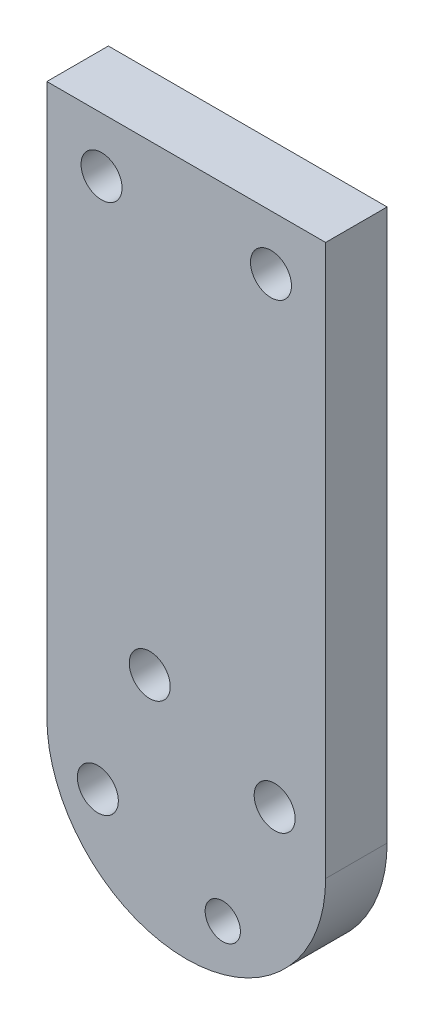
ISO-10303-21;
HEADER;
FILE_DESCRIPTION(('STEP AP214'),'2;1');
FILE_NAME('part.step','',(''),(''),'','','');
FILE_SCHEMA(('AUTOMOTIVE_DESIGN { 1 0 10303 214 1 1 1 1 }'));
ENDSEC;
DATA;
#1=APPLICATION_CONTEXT('core data for automotive mechanical design processes');
#2=APPLICATION_PROTOCOL_DEFINITION('international standard','automotive_design',2000,#1);
#3=PRODUCT_CONTEXT('',#1,'mechanical');
#4=PRODUCT('Part','Part','',(#3));
#5=PRODUCT_RELATED_PRODUCT_CATEGORY('part','',(#4));
#6=PRODUCT_DEFINITION_FORMATION('','',#4);
#7=PRODUCT_DEFINITION_CONTEXT('part definition',#1,'design');
#8=PRODUCT_DEFINITION('design','',#6,#7);
#9=PRODUCT_DEFINITION_SHAPE('','',#8);
#10=(LENGTH_UNIT() NAMED_UNIT(*) SI_UNIT(.MILLI.,.METRE.));
#11=(NAMED_UNIT(*) PLANE_ANGLE_UNIT() SI_UNIT($,.RADIAN.));
#12=(NAMED_UNIT(*) SI_UNIT($,.STERADIAN.) SOLID_ANGLE_UNIT());
#13=UNCERTAINTY_MEASURE_WITH_UNIT(LENGTH_MEASURE(1.E-05),#10,'distance_accuracy_value','');
#14=(GEOMETRIC_REPRESENTATION_CONTEXT(3) GLOBAL_UNCERTAINTY_ASSIGNED_CONTEXT((#13)) GLOBAL_UNIT_ASSIGNED_CONTEXT((#10,
#11,#12)) REPRESENTATION_CONTEXT('',''));
#15=CARTESIAN_POINT('',(0.,0.,0.));
#16=DIRECTION('',(0.,0.,1.));
#17=DIRECTION('',(1.,0.,0.));
#18=AXIS2_PLACEMENT_3D('',#15,#16,#17);
#19=CARTESIAN_POINT('',(-20.4,0.,4.5));
#20=DIRECTION('',(-1.,0.,0.));
#21=DIRECTION('',(0.,0.,1.));
#22=AXIS2_PLACEMENT_3D('',#19,#20,#21);
#23=PLANE('',#22);
#24=DIRECTION('',(0.,1.,0.));
#25=VECTOR('',#24,1.);
#26=CARTESIAN_POINT('',(-20.4,0.,0.));
#27=LINE('',#26,#25);
#28=CARTESIAN_POINT('',(-20.4,0.,0.));
#29=VERTEX_POINT('',#28);
#30=CARTESIAN_POINT('',(-20.4,40.3152746935112,0.));
#31=VERTEX_POINT('',#30);
#32=EDGE_CURVE('E145',#29,#31,#27,.T.);
#33=ORIENTED_EDGE('',*,*,#32,.F.);
#34=DIRECTION('',(0.,0.,-1.));
#35=VECTOR('',#34,1.);
#36=CARTESIAN_POINT('',(-20.4,0.,4.5));
#37=LINE('',#36,#35);
#38=CARTESIAN_POINT('',(-20.4,0.,4.5));
#39=VERTEX_POINT('',#38);
#40=EDGE_CURVE('E11',#39,#29,#37,.T.);
#41=ORIENTED_EDGE('',*,*,#40,.F.);
#42=DIRECTION('',(0.,1.,0.));
#43=VECTOR('',#42,1.);
#44=CARTESIAN_POINT('',(-20.4,0.,4.5));
#45=LINE('',#44,#43);
#46=CARTESIAN_POINT('',(-20.4,40.3152746935112,4.5));
#47=VERTEX_POINT('',#46);
#48=EDGE_CURVE('E107',#39,#47,#45,.T.);
#49=ORIENTED_EDGE('',*,*,#48,.T.);
#50=DIRECTION('',(0.,0.,-1.));
#51=VECTOR('',#50,1.);
#52=CARTESIAN_POINT('',(-20.4,40.3152746935112,4.5));
#53=LINE('',#52,#51);
#54=EDGE_CURVE('E87',#47,#31,#53,.T.);
#55=ORIENTED_EDGE('',*,*,#54,.T.);
#56=EDGE_LOOP('',(#33,#41,#49,#55));
#57=FACE_BOUND('',#56,.T.);
#58=ADVANCED_FACE('F47',(#57),#23,.T.);
#59=CARTESIAN_POINT('',(-10.2,0.,4.5));
#60=DIRECTION('',(0.,0.,-1.));
#61=DIRECTION('',(-1.,0.,0.));
#62=AXIS2_PLACEMENT_3D('',#59,#60,#61);
#63=CYLINDRICAL_SURFACE('',#62,10.2);
#64=CARTESIAN_POINT('',(-10.2,0.,0.));
#65=DIRECTION('',(0.,0.,1.));
#66=DIRECTION('',(1.,0.,0.));
#67=AXIS2_PLACEMENT_3D('',#64,#65,#66);
#68=CIRCLE('',#67,10.2);
#69=CARTESIAN_POINT('',(0.,0.,0.));
#70=VERTEX_POINT('',#69);
#71=EDGE_CURVE('E113',#29,#70,#68,.T.);
#72=ORIENTED_EDGE('',*,*,#71,.T.);
#73=DIRECTION('',(0.,0.,-1.));
#74=VECTOR('',#73,1.);
#75=CARTESIAN_POINT('',(0.,0.,4.5));
#76=LINE('',#75,#74);
#77=CARTESIAN_POINT('',(0.,0.,4.5));
#78=VERTEX_POINT('',#77);
#79=EDGE_CURVE('E57',#78,#70,#76,.T.);
#80=ORIENTED_EDGE('',*,*,#79,.F.);
#81=CARTESIAN_POINT('',(-10.2,0.,4.5));
#82=DIRECTION('',(0.,0.,1.));
#83=DIRECTION('',(1.,0.,0.));
#84=AXIS2_PLACEMENT_3D('',#81,#82,#83);
#85=CIRCLE('',#84,10.2);
#86=EDGE_CURVE('E103',#39,#78,#85,.T.);
#87=ORIENTED_EDGE('',*,*,#86,.F.);
#88=ORIENTED_EDGE('',*,*,#40,.T.);
#89=EDGE_LOOP('',(#72,#80,#87,#88));
#90=FACE_BOUND('',#89,.T.);
#91=ADVANCED_FACE('F111',(#90),#63,.T.);
#92=CARTESIAN_POINT('',(0.,0.,4.5));
#93=DIRECTION('',(-1.,0.,0.));
#94=DIRECTION('',(0.,0.,1.));
#95=AXIS2_PLACEMENT_3D('',#92,#93,#94);
#96=PLANE('',#95);
#97=DIRECTION('',(0.,1.,0.));
#98=VECTOR('',#97,1.);
#99=CARTESIAN_POINT('',(0.,0.,0.));
#100=LINE('',#99,#98);
#101=CARTESIAN_POINT('',(0.,40.3152746935112,0.));
#102=VERTEX_POINT('',#101);
#103=EDGE_CURVE('E140',#70,#102,#100,.T.);
#104=ORIENTED_EDGE('',*,*,#103,.T.);
#105=DIRECTION('',(0.,0.,-1.));
#106=VECTOR('',#105,1.);
#107=CARTESIAN_POINT('',(0.,40.3152746935112,4.5));
#108=LINE('',#107,#106);
#109=CARTESIAN_POINT('',(0.,40.3152746935112,4.5));
#110=VERTEX_POINT('',#109);
#111=EDGE_CURVE('E101',#110,#102,#108,.T.);
#112=ORIENTED_EDGE('',*,*,#111,.F.);
#113=DIRECTION('',(0.,1.,0.));
#114=VECTOR('',#113,1.);
#115=CARTESIAN_POINT('',(0.,0.,4.5));
#116=LINE('',#115,#114);
#117=EDGE_CURVE('E95',#78,#110,#116,.T.);
#118=ORIENTED_EDGE('',*,*,#117,.F.);
#119=ORIENTED_EDGE('',*,*,#79,.T.);
#120=EDGE_LOOP('',(#104,#112,#118,#119));
#121=FACE_BOUND('',#120,.T.);
#122=ADVANCED_FACE('F98',(#121),#96,.F.);
#123=CARTESIAN_POINT('',(-16.6702037458238,-2.67141600794886,4.5));
#124=DIRECTION('',(0.,0.,-1.));
#125=DIRECTION('',(-1.,0.,0.));
#126=AXIS2_PLACEMENT_3D('',#123,#124,#125);
#127=CYLINDRICAL_SURFACE('',#126,1.50000000000032);
#128=CARTESIAN_POINT('',(-16.6702037458238,-2.67141600794886,4.5));
#129=DIRECTION('',(0.,0.,1.));
#130=DIRECTION('',(1.,0.,0.));
#131=AXIS2_PLACEMENT_3D('',#128,#129,#130);
#132=CIRCLE('',#131,1.50000000000032);
#133=CARTESIAN_POINT('',(-15.1702037458234,-2.67141600794886,4.5));
#134=VERTEX_POINT('',#133);
#135=EDGE_CURVE('E159',#134,#134,#132,.T.);
#136=ORIENTED_EDGE('',*,*,#135,.T.);
#137=EDGE_LOOP('',(#136));
#138=FACE_BOUND('',#137,.T.);
#139=CARTESIAN_POINT('',(-16.6702037458238,-2.67141600794886,0.));
#140=DIRECTION('',(0.,0.,1.));
#141=DIRECTION('',(1.,0.,0.));
#142=AXIS2_PLACEMENT_3D('',#139,#140,#141);
#143=CIRCLE('',#142,1.50000000000032);
#144=CARTESIAN_POINT('',(-15.1702037458234,-2.67141600794886,0.));
#145=VERTEX_POINT('',#144);
#146=EDGE_CURVE('E126',#145,#145,#143,.T.);
#147=ORIENTED_EDGE('',*,*,#146,.F.);
#148=EDGE_LOOP('',(#147));
#149=FACE_BOUND('',#148,.T.);
#150=ADVANCED_FACE('F226',(#138,#149),#127,.F.);
#151=CARTESIAN_POINT('',(-3.72979625417587,2.67141600794901,4.5));
#152=DIRECTION('',(0.,0.,-1.));
#153=DIRECTION('',(-1.,0.,0.));
#154=AXIS2_PLACEMENT_3D('',#151,#152,#153);
#155=CYLINDRICAL_SURFACE('',#154,1.50000000000018);
#156=CARTESIAN_POINT('',(-3.72979625417587,2.67141600794901,4.5));
#157=DIRECTION('',(0.,0.,1.));
#158=DIRECTION('',(1.,0.,0.));
#159=AXIS2_PLACEMENT_3D('',#156,#157,#158);
#160=CIRCLE('',#159,1.50000000000018);
#161=CARTESIAN_POINT('',(-2.2297962541757,2.67141600794901,4.5));
#162=VERTEX_POINT('',#161);
#163=EDGE_CURVE('E163',#162,#162,#160,.T.);
#164=ORIENTED_EDGE('',*,*,#163,.T.);
#165=EDGE_LOOP('',(#164));
#166=FACE_BOUND('',#165,.T.);
#167=CARTESIAN_POINT('',(-3.72979625417587,2.67141600794901,0.));
#168=DIRECTION('',(0.,0.,1.));
#169=DIRECTION('',(1.,0.,0.));
#170=AXIS2_PLACEMENT_3D('',#167,#168,#169);
#171=CIRCLE('',#170,1.50000000000018);
#172=CARTESIAN_POINT('',(-2.2297962541757,2.67141600794901,0.));
#173=VERTEX_POINT('',#172);
#174=EDGE_CURVE('E130',#173,#173,#171,.T.);
#175=ORIENTED_EDGE('',*,*,#174,.F.);
#176=EDGE_LOOP('',(#175));
#177=FACE_BOUND('',#176,.T.);
#178=ADVANCED_FACE('F233',(#166,#177),#155,.F.);
#179=CARTESIAN_POINT('',(-12.8714160079488,6.47020374582401,4.5));
#180=DIRECTION('',(0.,0.,-1.));
#181=DIRECTION('',(-1.,0.,0.));
#182=AXIS2_PLACEMENT_3D('',#179,#180,#181);
#183=CYLINDRICAL_SURFACE('',#182,1.50000000000042);
#184=CARTESIAN_POINT('',(-12.8714160079488,6.47020374582401,4.5));
#185=DIRECTION('',(0.,0.,1.));
#186=DIRECTION('',(1.,0.,0.));
#187=AXIS2_PLACEMENT_3D('',#184,#185,#186);
#188=CIRCLE('',#187,1.50000000000042);
#189=CARTESIAN_POINT('',(-11.3714160079483,6.47020374582401,4.5));
#190=VERTEX_POINT('',#189);
#191=EDGE_CURVE('E167',#190,#190,#188,.T.);
#192=ORIENTED_EDGE('',*,*,#191,.T.);
#193=EDGE_LOOP('',(#192));
#194=FACE_BOUND('',#193,.T.);
#195=CARTESIAN_POINT('',(-12.8714160079488,6.47020374582401,0.));
#196=DIRECTION('',(0.,0.,1.));
#197=DIRECTION('',(1.,0.,0.));
#198=AXIS2_PLACEMENT_3D('',#195,#196,#197);
#199=CIRCLE('',#198,1.50000000000042);
#200=CARTESIAN_POINT('',(-11.3714160079483,6.47020374582401,0.));
#201=VERTEX_POINT('',#200);
#202=EDGE_CURVE('E134',#201,#201,#199,.T.);
#203=ORIENTED_EDGE('',*,*,#202,.F.);
#204=EDGE_LOOP('',(#203));
#205=FACE_BOUND('',#204,.T.);
#206=ADVANCED_FACE('F229',(#194,#205),#183,.F.);
#207=CARTESIAN_POINT('',(0.,40.3152746935112,4.5));
#208=DIRECTION('',(0.,-1.,0.));
#209=DIRECTION('',(0.,0.,-1.));
#210=AXIS2_PLACEMENT_3D('',#207,#208,#209);
#211=PLANE('',#210);
#212=DIRECTION('',(-1.,0.,0.));
#213=VECTOR('',#212,1.);
#214=CARTESIAN_POINT('',(0.,40.3152746935112,0.));
#215=LINE('',#214,#213);
#216=EDGE_CURVE('E80',#102,#31,#215,.T.);
#217=ORIENTED_EDGE('',*,*,#216,.T.);
#218=ORIENTED_EDGE('',*,*,#54,.F.);
#219=DIRECTION('',(-1.,0.,0.));
#220=VECTOR('',#219,1.);
#221=CARTESIAN_POINT('',(0.,40.3152746935112,4.5));
#222=LINE('',#221,#220);
#223=EDGE_CURVE('E65',#110,#47,#222,.T.);
#224=ORIENTED_EDGE('',*,*,#223,.F.);
#225=ORIENTED_EDGE('',*,*,#111,.T.);
#226=EDGE_LOOP('',(#217,#218,#224,#225));
#227=FACE_BOUND('',#226,.T.);
#228=ADVANCED_FACE('F195',(#227),#211,.F.);
#229=CARTESIAN_POINT('',(-16.4,36.3152746935112,4.5));
#230=DIRECTION('',(0.,0.,-1.));
#231=DIRECTION('',(-1.,0.,0.));
#232=AXIS2_PLACEMENT_3D('',#229,#230,#231);
#233=CYLINDRICAL_SURFACE('',#232,1.5);
#234=CARTESIAN_POINT('',(-16.4,36.3152746935112,4.5));
#235=DIRECTION('',(0.,0.,1.));
#236=DIRECTION('',(1.,0.,0.));
#237=AXIS2_PLACEMENT_3D('',#234,#235,#236);
#238=CIRCLE('',#237,1.5);
#239=CARTESIAN_POINT('',(-14.9,36.3152746935112,4.5));
#240=VERTEX_POINT('',#239);
#241=EDGE_CURVE('E175',#240,#240,#238,.T.);
#242=ORIENTED_EDGE('',*,*,#241,.T.);
#243=EDGE_LOOP('',(#242));
#244=FACE_BOUND('',#243,.T.);
#245=CARTESIAN_POINT('',(-16.4,36.3152746935112,0.));
#246=DIRECTION('',(0.,0.,1.));
#247=DIRECTION('',(1.,0.,0.));
#248=AXIS2_PLACEMENT_3D('',#245,#246,#247);
#249=CIRCLE('',#248,1.5);
#250=CARTESIAN_POINT('',(-14.9,36.3152746935112,0.));
#251=VERTEX_POINT('',#250);
#252=EDGE_CURVE('E148',#251,#251,#249,.T.);
#253=ORIENTED_EDGE('',*,*,#252,.F.);
#254=EDGE_LOOP('',(#253));
#255=FACE_BOUND('',#254,.T.);
#256=ADVANCED_FACE('F192',(#244,#255),#233,.F.);
#257=CARTESIAN_POINT('',(-4.,36.3152746935112,4.5));
#258=DIRECTION('',(0.,0.,-1.));
#259=DIRECTION('',(-1.,0.,0.));
#260=AXIS2_PLACEMENT_3D('',#257,#258,#259);
#261=CYLINDRICAL_SURFACE('',#260,1.50000000000001);
#262=CARTESIAN_POINT('',(-4.,36.3152746935112,4.5));
#263=DIRECTION('',(0.,0.,1.));
#264=DIRECTION('',(1.,0.,0.));
#265=AXIS2_PLACEMENT_3D('',#262,#263,#264);
#266=CIRCLE('',#265,1.50000000000001);
#267=CARTESIAN_POINT('',(-2.5,36.3152746935112,4.5));
#268=VERTEX_POINT('',#267);
#269=EDGE_CURVE('E125',#268,#268,#266,.T.);
#270=ORIENTED_EDGE('',*,*,#269,.T.);
#271=EDGE_LOOP('',(#270));
#272=FACE_BOUND('',#271,.T.);
#273=CARTESIAN_POINT('',(-4.,36.3152746935112,0.));
#274=DIRECTION('',(0.,0.,1.));
#275=DIRECTION('',(1.,0.,0.));
#276=AXIS2_PLACEMENT_3D('',#273,#274,#275);
#277=CIRCLE('',#276,1.50000000000001);
#278=CARTESIAN_POINT('',(-2.5,36.3152746935112,0.));
#279=VERTEX_POINT('',#278);
#280=EDGE_CURVE('E152',#279,#279,#277,.T.);
#281=ORIENTED_EDGE('',*,*,#280,.F.);
#282=EDGE_LOOP('',(#281));
#283=FACE_BOUND('',#282,.T.);
#284=ADVANCED_FACE('F49',(#272,#283),#261,.F.);
#285=CARTESIAN_POINT('',(-7.52858399205088,-6.47020374582387,4.5));
#286=DIRECTION('',(0.,0.,-1.));
#287=DIRECTION('',(-1.,0.,0.));
#288=AXIS2_PLACEMENT_3D('',#285,#286,#287);
#289=CYLINDRICAL_SURFACE('',#288,1.28990299368884);
#290=CARTESIAN_POINT('',(-7.52858399205088,-6.47020374582387,4.5));
#291=DIRECTION('',(0.,0.,1.));
#292=DIRECTION('',(1.,0.,0.));
#293=AXIS2_PLACEMENT_3D('',#290,#291,#292);
#294=CIRCLE('',#293,1.28990299368884);
#295=CARTESIAN_POINT('',(-6.23868099836204,-6.47020374582387,4.5));
#296=VERTEX_POINT('',#295);
#297=EDGE_CURVE('E120',#296,#296,#294,.T.);
#298=ORIENTED_EDGE('',*,*,#297,.T.);
#299=EDGE_LOOP('',(#298));
#300=FACE_BOUND('',#299,.T.);
#301=CARTESIAN_POINT('',(-7.52858399205088,-6.47020374582387,0.));
#302=DIRECTION('',(0.,0.,1.));
#303=DIRECTION('',(1.,0.,0.));
#304=AXIS2_PLACEMENT_3D('',#301,#302,#303);
#305=CIRCLE('',#304,1.28990299368884);
#306=CARTESIAN_POINT('',(-6.23868099836204,-6.47020374582387,0.));
#307=VERTEX_POINT('',#306);
#308=EDGE_CURVE('E121',#307,#307,#305,.T.);
#309=ORIENTED_EDGE('',*,*,#308,.F.);
#310=EDGE_LOOP('',(#309));
#311=FACE_BOUND('',#310,.T.);
#312=ADVANCED_FACE('F188',(#300,#311),#289,.F.);
#313=CARTESIAN_POINT('',(0.,0.,4.5));
#314=DIRECTION('',(0.,0.,1.));
#315=DIRECTION('',(1.,0.,0.));
#316=AXIS2_PLACEMENT_3D('',#313,#314,#315);
#317=PLANE('',#316);
#318=ORIENTED_EDGE('',*,*,#269,.F.);
#319=EDGE_LOOP('',(#318));
#320=FACE_BOUND('',#319,.T.);
#321=ORIENTED_EDGE('',*,*,#241,.F.);
#322=EDGE_LOOP('',(#321));
#323=FACE_BOUND('',#322,.T.);
#324=ORIENTED_EDGE('',*,*,#48,.F.);
#325=ORIENTED_EDGE('',*,*,#86,.T.);
#326=ORIENTED_EDGE('',*,*,#117,.T.);
#327=ORIENTED_EDGE('',*,*,#223,.T.);
#328=EDGE_LOOP('',(#324,#325,#326,#327));
#329=FACE_BOUND('',#328,.T.);
#330=ORIENTED_EDGE('',*,*,#191,.F.);
#331=EDGE_LOOP('',(#330));
#332=FACE_BOUND('',#331,.T.);
#333=ORIENTED_EDGE('',*,*,#163,.F.);
#334=EDGE_LOOP('',(#333));
#335=FACE_BOUND('',#334,.T.);
#336=ORIENTED_EDGE('',*,*,#135,.F.);
#337=EDGE_LOOP('',(#336));
#338=FACE_BOUND('',#337,.T.);
#339=ORIENTED_EDGE('',*,*,#297,.F.);
#340=EDGE_LOOP('',(#339));
#341=FACE_BOUND('',#340,.T.);
#342=ADVANCED_FACE('F105',(#320,#323,#329,#332,#335,#338,#341),#317,.T.);
#343=CARTESIAN_POINT('',(0.,0.,0.));
#344=DIRECTION('',(0.,0.,1.));
#345=DIRECTION('',(1.,0.,0.));
#346=AXIS2_PLACEMENT_3D('',#343,#344,#345);
#347=PLANE('',#346);
#348=ORIENTED_EDGE('',*,*,#280,.T.);
#349=EDGE_LOOP('',(#348));
#350=FACE_BOUND('',#349,.T.);
#351=ORIENTED_EDGE('',*,*,#252,.T.);
#352=EDGE_LOOP('',(#351));
#353=FACE_BOUND('',#352,.T.);
#354=ORIENTED_EDGE('',*,*,#32,.T.);
#355=ORIENTED_EDGE('',*,*,#216,.F.);
#356=ORIENTED_EDGE('',*,*,#103,.F.);
#357=ORIENTED_EDGE('',*,*,#71,.F.);
#358=EDGE_LOOP('',(#354,#355,#356,#357));
#359=FACE_BOUND('',#358,.T.);
#360=ORIENTED_EDGE('',*,*,#202,.T.);
#361=EDGE_LOOP('',(#360));
#362=FACE_BOUND('',#361,.T.);
#363=ORIENTED_EDGE('',*,*,#174,.T.);
#364=EDGE_LOOP('',(#363));
#365=FACE_BOUND('',#364,.T.);
#366=ORIENTED_EDGE('',*,*,#146,.T.);
#367=EDGE_LOOP('',(#366));
#368=FACE_BOUND('',#367,.T.);
#369=ORIENTED_EDGE('',*,*,#308,.T.);
#370=EDGE_LOOP('',(#369));
#371=FACE_BOUND('',#370,.T.);
#372=ADVANCED_FACE('F187',(#350,#353,#359,#362,#365,#368,#371),#347,.F.);
#373=CLOSED_SHELL('',(#58,#91,#122,#150,#178,#206,#228,#256,#284,#312,#342,#372));
#374=MANIFOLD_SOLID_BREP('B2',#373);
#375=ADVANCED_BREP_SHAPE_REPRESENTATION('',(#18,#374),#14);
#376=SHAPE_DEFINITION_REPRESENTATION(#9,#375);
ENDSEC;
END-ISO-10303-21;
